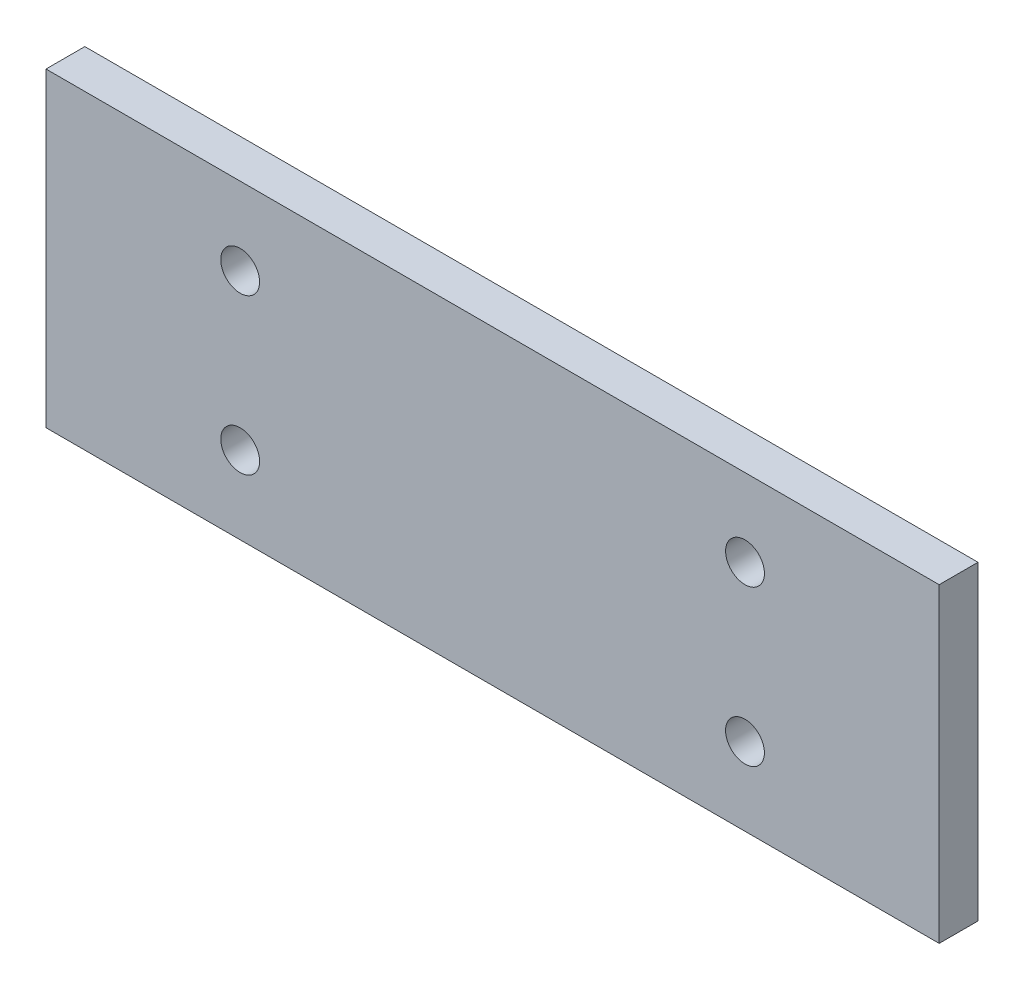
ISO-10303-21;
HEADER;
FILE_DESCRIPTION(('STEP AP214'),'2;1');
FILE_NAME('part.step','',(''),(''),'','','');
FILE_SCHEMA(('AUTOMOTIVE_DESIGN { 1 0 10303 214 1 1 1 1 }'));
ENDSEC;
DATA;
#1=APPLICATION_CONTEXT('core data for automotive mechanical design processes');
#2=APPLICATION_PROTOCOL_DEFINITION('international standard','automotive_design',2000,#1);
#3=PRODUCT_CONTEXT('',#1,'mechanical');
#4=PRODUCT('Part','Part','',(#3));
#5=PRODUCT_RELATED_PRODUCT_CATEGORY('part','',(#4));
#6=PRODUCT_DEFINITION_FORMATION('','',#4);
#7=PRODUCT_DEFINITION_CONTEXT('part definition',#1,'design');
#8=PRODUCT_DEFINITION('design','',#6,#7);
#9=PRODUCT_DEFINITION_SHAPE('','',#8);
#10=(LENGTH_UNIT() NAMED_UNIT(*) SI_UNIT(.MILLI.,.METRE.));
#11=(NAMED_UNIT(*) PLANE_ANGLE_UNIT() SI_UNIT($,.RADIAN.));
#12=(NAMED_UNIT(*) SI_UNIT($,.STERADIAN.) SOLID_ANGLE_UNIT());
#13=UNCERTAINTY_MEASURE_WITH_UNIT(LENGTH_MEASURE(1.E-05),#10,'distance_accuracy_value','');
#14=(GEOMETRIC_REPRESENTATION_CONTEXT(3) GLOBAL_UNCERTAINTY_ASSIGNED_CONTEXT((#13)) GLOBAL_UNIT_ASSIGNED_CONTEXT((#10,
#11,#12)) REPRESENTATION_CONTEXT('',''));
#15=CARTESIAN_POINT('',(0.,0.,0.));
#16=DIRECTION('',(0.,0.,1.));
#17=DIRECTION('',(1.,0.,0.));
#18=AXIS2_PLACEMENT_3D('',#15,#16,#17);
#19=CARTESIAN_POINT('',(0.,0.,5.));
#20=DIRECTION('',(0.,0.,-1.));
#21=DIRECTION('',(-1.,0.,0.));
#22=AXIS2_PLACEMENT_3D('',#19,#20,#21);
#23=PLANE('',#22);
#24=DIRECTION('',(0.,1.,0.));
#25=VECTOR('',#24,1.);
#26=CARTESIAN_POINT('',(57.5,-20.,5.));
#27=LINE('',#26,#25);
#28=CARTESIAN_POINT('',(57.5,-20.,5.));
#29=VERTEX_POINT('',#28);
#30=CARTESIAN_POINT('',(57.5,20.,5.));
#31=VERTEX_POINT('',#30);
#32=EDGE_CURVE('E89',#29,#31,#27,.T.);
#33=ORIENTED_EDGE('',*,*,#32,.T.);
#34=DIRECTION('',(-1.,0.,0.));
#35=VECTOR('',#34,1.);
#36=CARTESIAN_POINT('',(-57.5,20.,5.));
#37=LINE('',#36,#35);
#38=CARTESIAN_POINT('',(-57.5,20.,5.));
#39=VERTEX_POINT('',#38);
#40=EDGE_CURVE('E84',#31,#39,#37,.T.);
#41=ORIENTED_EDGE('',*,*,#40,.T.);
#42=DIRECTION('',(0.,-1.,0.));
#43=VECTOR('',#42,1.);
#44=CARTESIAN_POINT('',(-57.5,-20.,5.));
#45=LINE('',#44,#43);
#46=CARTESIAN_POINT('',(-57.5,-20.,5.));
#47=VERTEX_POINT('',#46);
#48=EDGE_CURVE('E87',#39,#47,#45,.T.);
#49=ORIENTED_EDGE('',*,*,#48,.T.);
#50=DIRECTION('',(1.,0.,0.));
#51=VECTOR('',#50,1.);
#52=CARTESIAN_POINT('',(-57.5,-20.,5.));
#53=LINE('',#52,#51);
#54=EDGE_CURVE('E54',#47,#29,#53,.T.);
#55=ORIENTED_EDGE('',*,*,#54,.T.);
#56=EDGE_LOOP('',(#33,#41,#49,#55));
#57=FACE_BOUND('',#56,.T.);
#58=CARTESIAN_POINT('',(-32.5,10.,5.));
#59=DIRECTION('',(0.,0.,1.));
#60=DIRECTION('',(1.,0.,0.));
#61=AXIS2_PLACEMENT_3D('',#58,#59,#60);
#62=CIRCLE('',#61,2.5);
#63=CARTESIAN_POINT('',(-30.,10.,5.));
#64=VERTEX_POINT('',#63);
#65=EDGE_CURVE('E104',#64,#64,#62,.T.);
#66=ORIENTED_EDGE('',*,*,#65,.F.);
#67=EDGE_LOOP('',(#66));
#68=FACE_BOUND('',#67,.T.);
#69=CARTESIAN_POINT('',(32.5,10.,5.));
#70=DIRECTION('',(0.,0.,1.));
#71=DIRECTION('',(1.,0.,0.));
#72=AXIS2_PLACEMENT_3D('',#69,#70,#71);
#73=CIRCLE('',#72,2.5);
#74=CARTESIAN_POINT('',(35.,10.,5.));
#75=VERTEX_POINT('',#74);
#76=EDGE_CURVE('E119',#75,#75,#73,.T.);
#77=ORIENTED_EDGE('',*,*,#76,.F.);
#78=EDGE_LOOP('',(#77));
#79=FACE_BOUND('',#78,.T.);
#80=CARTESIAN_POINT('',(32.5,-10.,5.));
#81=DIRECTION('',(0.,0.,1.));
#82=DIRECTION('',(-1.,0.,0.));
#83=AXIS2_PLACEMENT_3D('',#80,#81,#82);
#84=CIRCLE('',#83,2.5);
#85=CARTESIAN_POINT('',(30.,-10.,5.));
#86=VERTEX_POINT('',#85);
#87=EDGE_CURVE('E125',#86,#86,#84,.T.);
#88=ORIENTED_EDGE('',*,*,#87,.F.);
#89=EDGE_LOOP('',(#88));
#90=FACE_BOUND('',#89,.T.);
#91=CARTESIAN_POINT('',(-32.5,-9.99999999999997,5.));
#92=DIRECTION('',(0.,0.,1.));
#93=DIRECTION('',(-1.,0.,0.));
#94=AXIS2_PLACEMENT_3D('',#91,#92,#93);
#95=CIRCLE('',#94,2.5);
#96=CARTESIAN_POINT('',(-35.,-9.99999999999997,5.));
#97=VERTEX_POINT('',#96);
#98=EDGE_CURVE('E131',#97,#97,#95,.T.);
#99=ORIENTED_EDGE('',*,*,#98,.F.);
#100=EDGE_LOOP('',(#99));
#101=FACE_BOUND('',#100,.T.);
#102=ADVANCED_FACE('F37',(#57,#68,#79,#90,#101),#23,.F.);
#103=CARTESIAN_POINT('',(0.,0.,0.));
#104=DIRECTION('',(0.,0.,-1.));
#105=DIRECTION('',(-1.,0.,0.));
#106=AXIS2_PLACEMENT_3D('',#103,#104,#105);
#107=PLANE('',#106);
#108=CARTESIAN_POINT('',(32.5,-10.,0.));
#109=DIRECTION('',(0.,0.,1.));
#110=DIRECTION('',(-1.,0.,0.));
#111=AXIS2_PLACEMENT_3D('',#108,#109,#110);
#112=CIRCLE('',#111,2.5);
#113=CARTESIAN_POINT('',(30.,-10.,0.));
#114=VERTEX_POINT('',#113);
#115=EDGE_CURVE('E128',#114,#114,#112,.T.);
#116=ORIENTED_EDGE('',*,*,#115,.T.);
#117=EDGE_LOOP('',(#116));
#118=FACE_BOUND('',#117,.T.);
#119=CARTESIAN_POINT('',(-32.5,10.,0.));
#120=DIRECTION('',(0.,0.,1.));
#121=DIRECTION('',(1.,0.,0.));
#122=AXIS2_PLACEMENT_3D('',#119,#120,#121);
#123=CIRCLE('',#122,2.5);
#124=CARTESIAN_POINT('',(-30.,10.,0.));
#125=VERTEX_POINT('',#124);
#126=EDGE_CURVE('E116',#125,#125,#123,.T.);
#127=ORIENTED_EDGE('',*,*,#126,.T.);
#128=EDGE_LOOP('',(#127));
#129=FACE_BOUND('',#128,.T.);
#130=DIRECTION('',(0.,1.,0.));
#131=VECTOR('',#130,1.);
#132=CARTESIAN_POINT('',(57.5,-20.,0.));
#133=LINE('',#132,#131);
#134=CARTESIAN_POINT('',(57.5,-20.,0.));
#135=VERTEX_POINT('',#134);
#136=CARTESIAN_POINT('',(57.5,20.,0.));
#137=VERTEX_POINT('',#136);
#138=EDGE_CURVE('E101',#135,#137,#133,.T.);
#139=ORIENTED_EDGE('',*,*,#138,.F.);
#140=DIRECTION('',(1.,0.,0.));
#141=VECTOR('',#140,1.);
#142=CARTESIAN_POINT('',(-57.5,-20.,0.));
#143=LINE('',#142,#141);
#144=CARTESIAN_POINT('',(-57.5,-20.,0.));
#145=VERTEX_POINT('',#144);
#146=EDGE_CURVE('E77',#145,#135,#143,.T.);
#147=ORIENTED_EDGE('',*,*,#146,.F.);
#148=DIRECTION('',(0.,-1.,0.));
#149=VECTOR('',#148,1.);
#150=CARTESIAN_POINT('',(-57.5,-20.,0.));
#151=LINE('',#150,#149);
#152=CARTESIAN_POINT('',(-57.5,20.,0.));
#153=VERTEX_POINT('',#152);
#154=EDGE_CURVE('E71',#153,#145,#151,.T.);
#155=ORIENTED_EDGE('',*,*,#154,.F.);
#156=DIRECTION('',(-1.,0.,0.));
#157=VECTOR('',#156,1.);
#158=CARTESIAN_POINT('',(-57.5,20.,0.));
#159=LINE('',#158,#157);
#160=EDGE_CURVE('E93',#137,#153,#159,.T.);
#161=ORIENTED_EDGE('',*,*,#160,.F.);
#162=EDGE_LOOP('',(#139,#147,#155,#161));
#163=FACE_BOUND('',#162,.T.);
#164=CARTESIAN_POINT('',(32.5,10.,0.));
#165=DIRECTION('',(0.,0.,1.));
#166=DIRECTION('',(1.,0.,0.));
#167=AXIS2_PLACEMENT_3D('',#164,#165,#166);
#168=CIRCLE('',#167,2.5);
#169=CARTESIAN_POINT('',(35.,10.,0.));
#170=VERTEX_POINT('',#169);
#171=EDGE_CURVE('E122',#170,#170,#168,.T.);
#172=ORIENTED_EDGE('',*,*,#171,.T.);
#173=EDGE_LOOP('',(#172));
#174=FACE_BOUND('',#173,.T.);
#175=CARTESIAN_POINT('',(-32.5,-9.99999999999997,0.));
#176=DIRECTION('',(0.,0.,1.));
#177=DIRECTION('',(-1.,0.,0.));
#178=AXIS2_PLACEMENT_3D('',#175,#176,#177);
#179=CIRCLE('',#178,2.5);
#180=CARTESIAN_POINT('',(-35.,-9.99999999999997,0.));
#181=VERTEX_POINT('',#180);
#182=EDGE_CURVE('E134',#181,#181,#179,.T.);
#183=ORIENTED_EDGE('',*,*,#182,.T.);
#184=EDGE_LOOP('',(#183));
#185=FACE_BOUND('',#184,.T.);
#186=ADVANCED_FACE('F112',(#118,#129,#163,#174,#185),#107,.T.);
#187=CARTESIAN_POINT('',(57.5,-20.,5.));
#188=DIRECTION('',(-1.,0.,0.));
#189=DIRECTION('',(0.,0.,1.));
#190=AXIS2_PLACEMENT_3D('',#187,#188,#189);
#191=PLANE('',#190);
#192=ORIENTED_EDGE('',*,*,#138,.T.);
#193=DIRECTION('',(0.,0.,-1.));
#194=VECTOR('',#193,1.);
#195=CARTESIAN_POINT('',(57.5,20.,5.));
#196=LINE('',#195,#194);
#197=EDGE_CURVE('E11',#31,#137,#196,.T.);
#198=ORIENTED_EDGE('',*,*,#197,.F.);
#199=ORIENTED_EDGE('',*,*,#32,.F.);
#200=DIRECTION('',(0.,0.,-1.));
#201=VECTOR('',#200,1.);
#202=CARTESIAN_POINT('',(57.5,-20.,5.));
#203=LINE('',#202,#201);
#204=EDGE_CURVE('E97',#29,#135,#203,.T.);
#205=ORIENTED_EDGE('',*,*,#204,.T.);
#206=EDGE_LOOP('',(#192,#198,#199,#205));
#207=FACE_BOUND('',#206,.T.);
#208=ADVANCED_FACE('F39',(#207),#191,.F.);
#209=CARTESIAN_POINT('',(-57.5,20.,5.));
#210=DIRECTION('',(0.,-1.,0.));
#211=DIRECTION('',(0.,0.,-1.));
#212=AXIS2_PLACEMENT_3D('',#209,#210,#211);
#213=PLANE('',#212);
#214=ORIENTED_EDGE('',*,*,#160,.T.);
#215=DIRECTION('',(0.,0.,-1.));
#216=VECTOR('',#215,1.);
#217=CARTESIAN_POINT('',(-57.5,20.,5.));
#218=LINE('',#217,#216);
#219=EDGE_CURVE('E46',#39,#153,#218,.T.);
#220=ORIENTED_EDGE('',*,*,#219,.F.);
#221=ORIENTED_EDGE('',*,*,#40,.F.);
#222=ORIENTED_EDGE('',*,*,#197,.T.);
#223=EDGE_LOOP('',(#214,#220,#221,#222));
#224=FACE_BOUND('',#223,.T.);
#225=ADVANCED_FACE('F92',(#224),#213,.F.);
#226=CARTESIAN_POINT('',(-57.5,-20.,5.));
#227=DIRECTION('',(1.,0.,0.));
#228=DIRECTION('',(0.,0.,-1.));
#229=AXIS2_PLACEMENT_3D('',#226,#227,#228);
#230=PLANE('',#229);
#231=ORIENTED_EDGE('',*,*,#154,.T.);
#232=DIRECTION('',(0.,0.,-1.));
#233=VECTOR('',#232,1.);
#234=CARTESIAN_POINT('',(-57.5,-20.,5.));
#235=LINE('',#234,#233);
#236=EDGE_CURVE('E94',#47,#145,#235,.T.);
#237=ORIENTED_EDGE('',*,*,#236,.F.);
#238=ORIENTED_EDGE('',*,*,#48,.F.);
#239=ORIENTED_EDGE('',*,*,#219,.T.);
#240=EDGE_LOOP('',(#231,#237,#238,#239));
#241=FACE_BOUND('',#240,.T.);
#242=ADVANCED_FACE('F95',(#241),#230,.F.);
#243=CARTESIAN_POINT('',(-57.5,-20.,5.));
#244=DIRECTION('',(0.,1.,0.));
#245=DIRECTION('',(0.,0.,1.));
#246=AXIS2_PLACEMENT_3D('',#243,#244,#245);
#247=PLANE('',#246);
#248=ORIENTED_EDGE('',*,*,#146,.T.);
#249=ORIENTED_EDGE('',*,*,#204,.F.);
#250=ORIENTED_EDGE('',*,*,#54,.F.);
#251=ORIENTED_EDGE('',*,*,#236,.T.);
#252=EDGE_LOOP('',(#248,#249,#250,#251));
#253=FACE_BOUND('',#252,.T.);
#254=ADVANCED_FACE('F109',(#253),#247,.F.);
#255=CARTESIAN_POINT('',(-32.5,10.,5.));
#256=DIRECTION('',(0.,0.,-1.));
#257=DIRECTION('',(-1.,0.,0.));
#258=AXIS2_PLACEMENT_3D('',#255,#256,#257);
#259=CYLINDRICAL_SURFACE('',#258,2.5);
#260=ORIENTED_EDGE('',*,*,#65,.T.);
#261=EDGE_LOOP('',(#260));
#262=FACE_BOUND('',#261,.T.);
#263=ORIENTED_EDGE('',*,*,#126,.F.);
#264=EDGE_LOOP('',(#263));
#265=FACE_BOUND('',#264,.T.);
#266=ADVANCED_FACE('F151',(#262,#265),#259,.F.);
#267=CARTESIAN_POINT('',(32.5,10.,5.));
#268=DIRECTION('',(0.,0.,-1.));
#269=DIRECTION('',(-1.,0.,0.));
#270=AXIS2_PLACEMENT_3D('',#267,#268,#269);
#271=CYLINDRICAL_SURFACE('',#270,2.5);
#272=ORIENTED_EDGE('',*,*,#76,.T.);
#273=EDGE_LOOP('',(#272));
#274=FACE_BOUND('',#273,.T.);
#275=ORIENTED_EDGE('',*,*,#171,.F.);
#276=EDGE_LOOP('',(#275));
#277=FACE_BOUND('',#276,.T.);
#278=ADVANCED_FACE('F205',(#274,#277),#271,.F.);
#279=CARTESIAN_POINT('',(32.5,-10.,5.));
#280=DIRECTION('',(0.,0.,-1.));
#281=DIRECTION('',(-1.,0.,0.));
#282=AXIS2_PLACEMENT_3D('',#279,#280,#281);
#283=CYLINDRICAL_SURFACE('',#282,2.5);
#284=ORIENTED_EDGE('',*,*,#87,.T.);
#285=EDGE_LOOP('',(#284));
#286=FACE_BOUND('',#285,.T.);
#287=ORIENTED_EDGE('',*,*,#115,.F.);
#288=EDGE_LOOP('',(#287));
#289=FACE_BOUND('',#288,.T.);
#290=ADVANCED_FACE('F214',(#286,#289),#283,.F.);
#291=CARTESIAN_POINT('',(-32.5,-9.99999999999997,5.));
#292=DIRECTION('',(0.,0.,-1.));
#293=DIRECTION('',(-1.,0.,0.));
#294=AXIS2_PLACEMENT_3D('',#291,#292,#293);
#295=CYLINDRICAL_SURFACE('',#294,2.5);
#296=ORIENTED_EDGE('',*,*,#98,.T.);
#297=EDGE_LOOP('',(#296));
#298=FACE_BOUND('',#297,.T.);
#299=ORIENTED_EDGE('',*,*,#182,.F.);
#300=EDGE_LOOP('',(#299));
#301=FACE_BOUND('',#300,.T.);
#302=ADVANCED_FACE('F140',(#298,#301),#295,.F.);
#303=CLOSED_SHELL('',(#102,#186,#208,#225,#242,#254,#266,#278,#290,#302));
#304=MANIFOLD_SOLID_BREP('B2',#303);
#305=ADVANCED_BREP_SHAPE_REPRESENTATION('',(#18,#304),#14);
#306=SHAPE_DEFINITION_REPRESENTATION(#9,#305);
ENDSEC;
END-ISO-10303-21;
